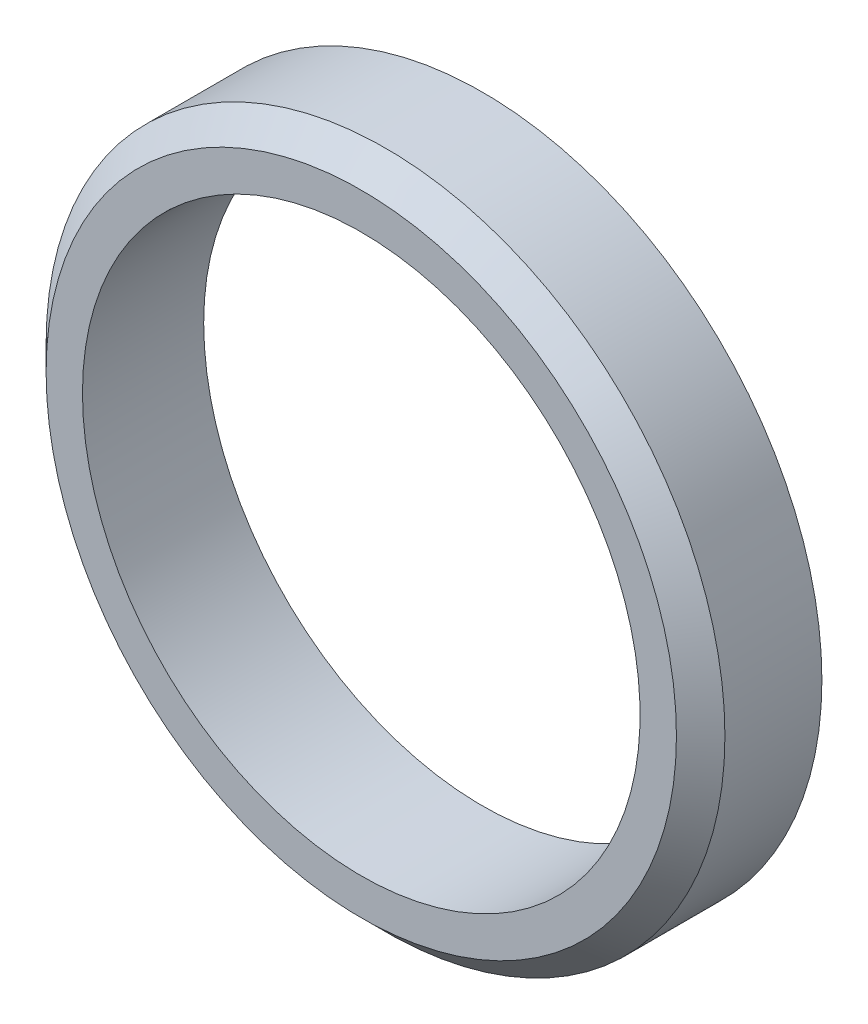
ISO-10303-21;
HEADER;
FILE_DESCRIPTION(('STEP AP214'),'2;1');
FILE_NAME('part.step','',(''),(''),'','','');
FILE_SCHEMA(('AUTOMOTIVE_DESIGN { 1 0 10303 214 1 1 1 1 }'));
ENDSEC;
DATA;
#1=APPLICATION_CONTEXT('core data for automotive mechanical design processes');
#2=APPLICATION_PROTOCOL_DEFINITION('international standard','automotive_design',2000,#1);
#3=PRODUCT_CONTEXT('',#1,'mechanical');
#4=PRODUCT('Part','Part','',(#3));
#5=PRODUCT_RELATED_PRODUCT_CATEGORY('part','',(#4));
#6=PRODUCT_DEFINITION_FORMATION('','',#4);
#7=PRODUCT_DEFINITION_CONTEXT('part definition',#1,'design');
#8=PRODUCT_DEFINITION('design','',#6,#7);
#9=PRODUCT_DEFINITION_SHAPE('','',#8);
#10=(LENGTH_UNIT() NAMED_UNIT(*) SI_UNIT(.MILLI.,.METRE.));
#11=(NAMED_UNIT(*) PLANE_ANGLE_UNIT() SI_UNIT($,.RADIAN.));
#12=(NAMED_UNIT(*) SI_UNIT($,.STERADIAN.) SOLID_ANGLE_UNIT());
#13=UNCERTAINTY_MEASURE_WITH_UNIT(LENGTH_MEASURE(1.E-05),#10,'distance_accuracy_value','');
#14=(GEOMETRIC_REPRESENTATION_CONTEXT(3) GLOBAL_UNCERTAINTY_ASSIGNED_CONTEXT((#13)) GLOBAL_UNIT_ASSIGNED_CONTEXT((#10,
#11,#12)) REPRESENTATION_CONTEXT('',''));
#15=CARTESIAN_POINT('',(0.,0.,0.));
#16=DIRECTION('',(0.,0.,1.));
#17=DIRECTION('',(1.,0.,0.));
#18=AXIS2_PLACEMENT_3D('',#15,#16,#17);
#19=CARTESIAN_POINT('',(0.,0.,25.));
#20=DIRECTION('',(0.,0.,-1.));
#21=DIRECTION('',(-1.,0.,0.));
#22=AXIS2_PLACEMENT_3D('',#19,#20,#21);
#23=CYLINDRICAL_SURFACE('',#22,70.);
#24=CARTESIAN_POINT('',(0.,0.,19.9999999999999));
#25=DIRECTION('',(0.,0.,1.));
#26=DIRECTION('',(1.,0.,0.));
#27=AXIS2_PLACEMENT_3D('',#24,#25,#26);
#28=CIRCLE('',#27,70.);
#29=CARTESIAN_POINT('',(70.,0.,19.9999999999999));
#30=VERTEX_POINT('',#29);
#31=EDGE_CURVE('E10',#30,#30,#28,.F.);
#32=ORIENTED_EDGE('',*,*,#31,.T.);
#33=EDGE_LOOP('',(#32));
#34=FACE_BOUND('',#33,.T.);
#35=CARTESIAN_POINT('',(0.,0.,0.));
#36=DIRECTION('',(0.,0.,1.));
#37=DIRECTION('',(1.,0.,0.));
#38=AXIS2_PLACEMENT_3D('',#35,#36,#37);
#39=CIRCLE('',#38,70.);
#40=CARTESIAN_POINT('',(70.,0.,0.));
#41=VERTEX_POINT('',#40);
#42=EDGE_CURVE('E44',#41,#41,#39,.T.);
#43=ORIENTED_EDGE('',*,*,#42,.T.);
#44=EDGE_LOOP('',(#43));
#45=FACE_BOUND('',#44,.T.);
#46=ADVANCED_FACE('F33',(#34,#45),#23,.T.);
#47=CARTESIAN_POINT('',(0.,0.,25.));
#48=DIRECTION('',(0.,0.,1.));
#49=DIRECTION('',(1.,0.,0.));
#50=AXIS2_PLACEMENT_3D('',#47,#48,#49);
#51=PLANE('',#50);
#52=CARTESIAN_POINT('',(0.,0.,25.));
#53=DIRECTION('',(0.,0.,-1.));
#54=DIRECTION('',(-1.,0.,0.));
#55=AXIS2_PLACEMENT_3D('',#52,#53,#54);
#56=CIRCLE('',#55,57.5);
#57=CARTESIAN_POINT('',(-57.5,0.,25.));
#58=VERTEX_POINT('',#57);
#59=EDGE_CURVE('E48',#58,#58,#56,.T.);
#60=ORIENTED_EDGE('',*,*,#59,.T.);
#61=EDGE_LOOP('',(#60));
#62=FACE_BOUND('',#61,.T.);
#63=CARTESIAN_POINT('',(0.,0.,25.));
#64=DIRECTION('',(0.,0.,1.));
#65=DIRECTION('',(1.,0.,0.));
#66=AXIS2_PLACEMENT_3D('',#63,#64,#65);
#67=CIRCLE('',#66,65.);
#68=CARTESIAN_POINT('',(65.,0.,25.));
#69=VERTEX_POINT('',#68);
#70=EDGE_CURVE('E40',#69,#69,#67,.T.);
#71=ORIENTED_EDGE('',*,*,#70,.T.);
#72=EDGE_LOOP('',(#71));
#73=FACE_BOUND('',#72,.T.);
#74=ADVANCED_FACE('F57',(#62,#73),#51,.T.);
#75=CARTESIAN_POINT('',(0.,0.,0.));
#76=DIRECTION('',(0.,0.,1.));
#77=DIRECTION('',(1.,0.,0.));
#78=AXIS2_PLACEMENT_3D('',#75,#76,#77);
#79=PLANE('',#78);
#80=CARTESIAN_POINT('',(0.,0.,0.));
#81=DIRECTION('',(0.,0.,-1.));
#82=DIRECTION('',(-1.,0.,0.));
#83=AXIS2_PLACEMENT_3D('',#80,#81,#82);
#84=CIRCLE('',#83,57.5);
#85=CARTESIAN_POINT('',(-57.5,0.,0.));
#86=VERTEX_POINT('',#85);
#87=EDGE_CURVE('E51',#86,#86,#84,.T.);
#88=ORIENTED_EDGE('',*,*,#87,.F.);
#89=EDGE_LOOP('',(#88));
#90=FACE_BOUND('',#89,.T.);
#91=ORIENTED_EDGE('',*,*,#42,.F.);
#92=EDGE_LOOP('',(#91));
#93=FACE_BOUND('',#92,.T.);
#94=ADVANCED_FACE('F65',(#90,#93),#79,.F.);
#95=CARTESIAN_POINT('',(0.,0.,25.));
#96=DIRECTION('',(0.,0.,-1.));
#97=DIRECTION('',(-1.,0.,0.));
#98=AXIS2_PLACEMENT_3D('',#95,#96,#97);
#99=CONICAL_SURFACE('',#98,65.,0.785398163397447);
#100=ORIENTED_EDGE('',*,*,#31,.F.);
#101=EDGE_LOOP('',(#100));
#102=FACE_BOUND('',#101,.T.);
#103=ORIENTED_EDGE('',*,*,#70,.F.);
#104=EDGE_LOOP('',(#103));
#105=FACE_BOUND('',#104,.T.);
#106=ADVANCED_FACE('F35',(#102,#105),#99,.T.);
#107=CARTESIAN_POINT('',(0.,0.,25.));
#108=DIRECTION('',(0.,0.,-1.));
#109=DIRECTION('',(-1.,0.,0.));
#110=AXIS2_PLACEMENT_3D('',#107,#108,#109);
#111=CYLINDRICAL_SURFACE('',#110,57.5);
#112=ORIENTED_EDGE('',*,*,#59,.F.);
#113=EDGE_LOOP('',(#112));
#114=FACE_BOUND('',#113,.T.);
#115=ORIENTED_EDGE('',*,*,#87,.T.);
#116=EDGE_LOOP('',(#115));
#117=FACE_BOUND('',#116,.T.);
#118=ADVANCED_FACE('F59',(#114,#117),#111,.F.);
#119=CLOSED_SHELL('',(#46,#74,#94,#106,#118));
#120=MANIFOLD_SOLID_BREP('B2',#119);
#121=ADVANCED_BREP_SHAPE_REPRESENTATION('',(#18,#120),#14);
#122=SHAPE_DEFINITION_REPRESENTATION(#9,#121);
ENDSEC;
END-ISO-10303-21;
